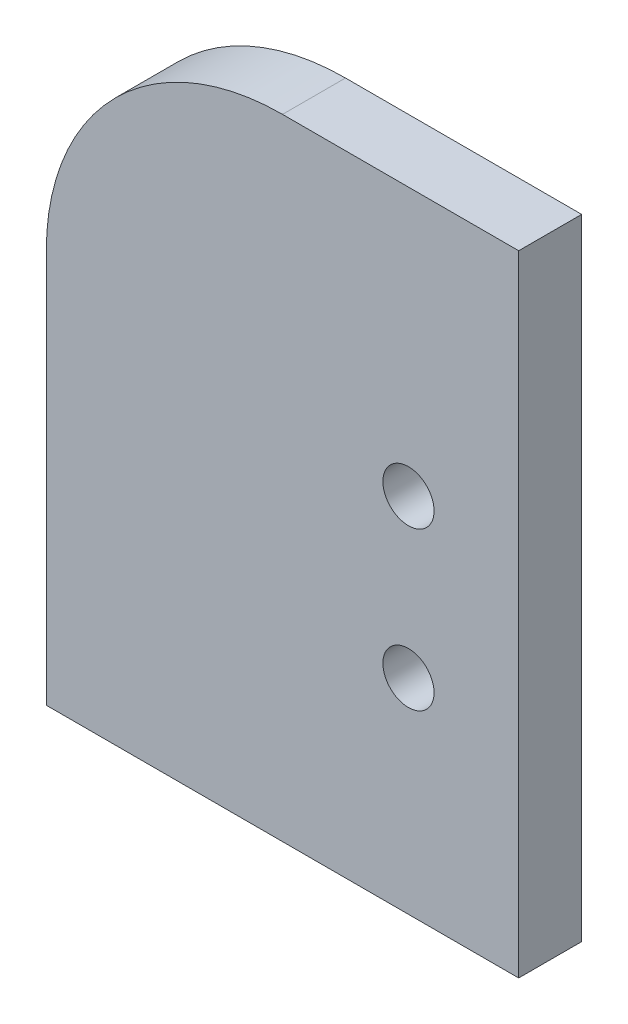
ISO-10303-21;
HEADER;
FILE_DESCRIPTION(('STEP AP214'),'2;1');
FILE_NAME('part.step','',(''),(''),'','','');
FILE_SCHEMA(('AUTOMOTIVE_DESIGN { 1 0 10303 214 1 1 1 1 }'));
ENDSEC;
DATA;
#1=APPLICATION_CONTEXT('core data for automotive mechanical design processes');
#2=APPLICATION_PROTOCOL_DEFINITION('international standard','automotive_design',2000,#1);
#3=PRODUCT_CONTEXT('',#1,'mechanical');
#4=PRODUCT('Part','Part','',(#3));
#5=PRODUCT_RELATED_PRODUCT_CATEGORY('part','',(#4));
#6=PRODUCT_DEFINITION_FORMATION('','',#4);
#7=PRODUCT_DEFINITION_CONTEXT('part definition',#1,'design');
#8=PRODUCT_DEFINITION('design','',#6,#7);
#9=PRODUCT_DEFINITION_SHAPE('','',#8);
#10=(LENGTH_UNIT() NAMED_UNIT(*) SI_UNIT(.MILLI.,.METRE.));
#11=(NAMED_UNIT(*) PLANE_ANGLE_UNIT() SI_UNIT($,.RADIAN.));
#12=(NAMED_UNIT(*) SI_UNIT($,.STERADIAN.) SOLID_ANGLE_UNIT());
#13=UNCERTAINTY_MEASURE_WITH_UNIT(LENGTH_MEASURE(1.E-05),#10,'distance_accuracy_value','');
#14=(GEOMETRIC_REPRESENTATION_CONTEXT(3) GLOBAL_UNCERTAINTY_ASSIGNED_CONTEXT((#13)) GLOBAL_UNIT_ASSIGNED_CONTEXT((#10,
#11,#12)) REPRESENTATION_CONTEXT('',''));
#15=CARTESIAN_POINT('',(0.,0.,0.));
#16=DIRECTION('',(0.,0.,1.));
#17=DIRECTION('',(1.,0.,0.));
#18=AXIS2_PLACEMENT_3D('',#15,#16,#17);
#19=CARTESIAN_POINT('',(0.,35.,4.));
#20=DIRECTION('',(-1.,0.,0.));
#21=DIRECTION('',(0.,0.,1.));
#22=AXIS2_PLACEMENT_3D('',#19,#20,#21);
#23=PLANE('',#22);
#24=DIRECTION('',(0.,1.,0.));
#25=VECTOR('',#24,1.);
#26=CARTESIAN_POINT('',(0.,35.,0.));
#27=LINE('',#26,#25);
#28=CARTESIAN_POINT('',(0.,0.,0.));
#29=VERTEX_POINT('',#28);
#30=CARTESIAN_POINT('',(0.,40.,0.));
#31=VERTEX_POINT('',#30);
#32=EDGE_CURVE('E76',#29,#31,#27,.T.);
#33=ORIENTED_EDGE('',*,*,#32,.T.);
#34=DIRECTION('',(0.,0.,-1.));
#35=VECTOR('',#34,1.);
#36=CARTESIAN_POINT('',(0.,40.,4.));
#37=LINE('',#36,#35);
#38=CARTESIAN_POINT('',(0.,40.,4.));
#39=VERTEX_POINT('',#38);
#40=EDGE_CURVE('E11',#39,#31,#37,.T.);
#41=ORIENTED_EDGE('',*,*,#40,.F.);
#42=DIRECTION('',(0.,1.,0.));
#43=VECTOR('',#42,1.);
#44=CARTESIAN_POINT('',(0.,0.,4.));
#45=LINE('',#44,#43);
#46=CARTESIAN_POINT('',(0.,0.,4.));
#47=VERTEX_POINT('',#46);
#48=EDGE_CURVE('E82',#47,#39,#45,.T.);
#49=ORIENTED_EDGE('',*,*,#48,.F.);
#50=DIRECTION('',(0.,0.,-1.));
#51=VECTOR('',#50,1.);
#52=CARTESIAN_POINT('',(0.,0.,4.));
#53=LINE('',#52,#51);
#54=EDGE_CURVE('E106',#47,#29,#53,.T.);
#55=ORIENTED_EDGE('',*,*,#54,.T.);
#56=EDGE_LOOP('',(#33,#41,#49,#55));
#57=FACE_BOUND('',#56,.T.);
#58=ADVANCED_FACE('F33',(#57),#23,.F.);
#59=CARTESIAN_POINT('',(-15.,40.,4.));
#60=DIRECTION('',(0.,-1.,0.));
#61=DIRECTION('',(0.,0.,-1.));
#62=AXIS2_PLACEMENT_3D('',#59,#60,#61);
#63=PLANE('',#62);
#64=DIRECTION('',(-1.,0.,0.));
#65=VECTOR('',#64,1.);
#66=CARTESIAN_POINT('',(-15.,40.,0.));
#67=LINE('',#66,#65);
#68=CARTESIAN_POINT('',(-15.,40.,0.));
#69=VERTEX_POINT('',#68);
#70=EDGE_CURVE('E111',#31,#69,#67,.T.);
#71=ORIENTED_EDGE('',*,*,#70,.T.);
#72=DIRECTION('',(0.,0.,-1.));
#73=VECTOR('',#72,1.);
#74=CARTESIAN_POINT('',(-15.,40.,4.));
#75=LINE('',#74,#73);
#76=CARTESIAN_POINT('',(-15.,40.,4.));
#77=VERTEX_POINT('',#76);
#78=EDGE_CURVE('E41',#77,#69,#75,.T.);
#79=ORIENTED_EDGE('',*,*,#78,.F.);
#80=DIRECTION('',(-1.,0.,0.));
#81=VECTOR('',#80,1.);
#82=CARTESIAN_POINT('',(-15.,40.,4.));
#83=LINE('',#82,#81);
#84=EDGE_CURVE('E93',#39,#77,#83,.T.);
#85=ORIENTED_EDGE('',*,*,#84,.F.);
#86=ORIENTED_EDGE('',*,*,#40,.T.);
#87=EDGE_LOOP('',(#71,#79,#85,#86));
#88=FACE_BOUND('',#87,.T.);
#89=ADVANCED_FACE('F162',(#88),#63,.F.);
#90=CARTESIAN_POINT('',(-15.,25.,4.));
#91=DIRECTION('',(0.,0.,-1.));
#92=DIRECTION('',(-1.,0.,0.));
#93=AXIS2_PLACEMENT_3D('',#90,#91,#92);
#94=CYLINDRICAL_SURFACE('',#93,15.);
#95=CARTESIAN_POINT('',(-15.,25.,0.));
#96=DIRECTION('',(0.,0.,1.));
#97=DIRECTION('',(1.,0.,0.));
#98=AXIS2_PLACEMENT_3D('',#95,#96,#97);
#99=CIRCLE('',#98,15.);
#100=CARTESIAN_POINT('',(-30.,25.,0.));
#101=VERTEX_POINT('',#100);
#102=EDGE_CURVE('E101',#69,#101,#99,.T.);
#103=ORIENTED_EDGE('',*,*,#102,.T.);
#104=DIRECTION('',(0.,0.,-1.));
#105=VECTOR('',#104,1.);
#106=CARTESIAN_POINT('',(-30.,25.,4.));
#107=LINE('',#106,#105);
#108=CARTESIAN_POINT('',(-30.,25.,4.));
#109=VERTEX_POINT('',#108);
#110=EDGE_CURVE('E98',#109,#101,#107,.T.);
#111=ORIENTED_EDGE('',*,*,#110,.F.);
#112=CARTESIAN_POINT('',(-15.,25.,4.));
#113=DIRECTION('',(0.,0.,1.));
#114=DIRECTION('',(1.,0.,0.));
#115=AXIS2_PLACEMENT_3D('',#112,#113,#114);
#116=CIRCLE('',#115,15.);
#117=EDGE_CURVE('E87',#77,#109,#116,.T.);
#118=ORIENTED_EDGE('',*,*,#117,.F.);
#119=ORIENTED_EDGE('',*,*,#78,.T.);
#120=EDGE_LOOP('',(#103,#111,#118,#119));
#121=FACE_BOUND('',#120,.T.);
#122=ADVANCED_FACE('F99',(#121),#94,.T.);
#123=CARTESIAN_POINT('',(-30.,0.,4.));
#124=DIRECTION('',(1.,0.,0.));
#125=DIRECTION('',(0.,0.,-1.));
#126=AXIS2_PLACEMENT_3D('',#123,#124,#125);
#127=PLANE('',#126);
#128=DIRECTION('',(0.,-1.,0.));
#129=VECTOR('',#128,1.);
#130=CARTESIAN_POINT('',(-30.,0.,0.));
#131=LINE('',#130,#129);
#132=CARTESIAN_POINT('',(-30.,0.,0.));
#133=VERTEX_POINT('',#132);
#134=EDGE_CURVE('E69',#101,#133,#131,.T.);
#135=ORIENTED_EDGE('',*,*,#134,.T.);
#136=DIRECTION('',(0.,0.,-1.));
#137=VECTOR('',#136,1.);
#138=CARTESIAN_POINT('',(-30.,0.,4.));
#139=LINE('',#138,#137);
#140=CARTESIAN_POINT('',(-30.,0.,4.));
#141=VERTEX_POINT('',#140);
#142=EDGE_CURVE('E102',#141,#133,#139,.T.);
#143=ORIENTED_EDGE('',*,*,#142,.F.);
#144=DIRECTION('',(0.,-1.,0.));
#145=VECTOR('',#144,1.);
#146=CARTESIAN_POINT('',(-30.,0.,4.));
#147=LINE('',#146,#145);
#148=EDGE_CURVE('E91',#109,#141,#147,.T.);
#149=ORIENTED_EDGE('',*,*,#148,.F.);
#150=ORIENTED_EDGE('',*,*,#110,.T.);
#151=EDGE_LOOP('',(#135,#143,#149,#150));
#152=FACE_BOUND('',#151,.T.);
#153=ADVANCED_FACE('F104',(#152),#127,.F.);
#154=CARTESIAN_POINT('',(0.,0.,4.));
#155=DIRECTION('',(0.,1.,0.));
#156=DIRECTION('',(-1.,0.,0.));
#157=AXIS2_PLACEMENT_3D('',#154,#155,#156);
#158=PLANE('',#157);
#159=DIRECTION('',(1.,0.,0.));
#160=VECTOR('',#159,1.);
#161=CARTESIAN_POINT('',(0.,0.,0.));
#162=LINE('',#161,#160);
#163=EDGE_CURVE('E116',#133,#29,#162,.T.);
#164=ORIENTED_EDGE('',*,*,#163,.T.);
#165=ORIENTED_EDGE('',*,*,#54,.F.);
#166=DIRECTION('',(1.,0.,0.));
#167=VECTOR('',#166,1.);
#168=CARTESIAN_POINT('',(0.,0.,4.));
#169=LINE('',#168,#167);
#170=EDGE_CURVE('E49',#141,#47,#169,.T.);
#171=ORIENTED_EDGE('',*,*,#170,.F.);
#172=ORIENTED_EDGE('',*,*,#142,.T.);
#173=EDGE_LOOP('',(#164,#165,#171,#172));
#174=FACE_BOUND('',#173,.T.);
#175=ADVANCED_FACE('F123',(#174),#158,.F.);
#176=CARTESIAN_POINT('',(-15.,25.,4.));
#177=DIRECTION('',(0.,0.,1.));
#178=DIRECTION('',(1.,0.,0.));
#179=AXIS2_PLACEMENT_3D('',#176,#177,#178);
#180=PLANE('',#179);
#181=CARTESIAN_POINT('',(-7.,13.,4.));
#182=DIRECTION('',(0.,0.,1.));
#183=DIRECTION('',(1.,0.,0.));
#184=AXIS2_PLACEMENT_3D('',#181,#182,#183);
#185=CIRCLE('',#184,1.625);
#186=CARTESIAN_POINT('',(-5.375,13.,4.));
#187=VERTEX_POINT('',#186);
#188=EDGE_CURVE('E133',#187,#187,#185,.T.);
#189=ORIENTED_EDGE('',*,*,#188,.F.);
#190=EDGE_LOOP('',(#189));
#191=FACE_BOUND('',#190,.T.);
#192=CARTESIAN_POINT('',(-7.,23.,4.));
#193=DIRECTION('',(0.,0.,1.));
#194=DIRECTION('',(1.,0.,0.));
#195=AXIS2_PLACEMENT_3D('',#192,#193,#194);
#196=CIRCLE('',#195,1.625);
#197=CARTESIAN_POINT('',(-5.375,23.,4.));
#198=VERTEX_POINT('',#197);
#199=EDGE_CURVE('E127',#198,#198,#196,.T.);
#200=ORIENTED_EDGE('',*,*,#199,.F.);
#201=EDGE_LOOP('',(#200));
#202=FACE_BOUND('',#201,.T.);
#203=ORIENTED_EDGE('',*,*,#48,.T.);
#204=ORIENTED_EDGE('',*,*,#84,.T.);
#205=ORIENTED_EDGE('',*,*,#117,.T.);
#206=ORIENTED_EDGE('',*,*,#148,.T.);
#207=ORIENTED_EDGE('',*,*,#170,.T.);
#208=EDGE_LOOP('',(#203,#204,#205,#206,#207));
#209=FACE_BOUND('',#208,.T.);
#210=ADVANCED_FACE('F89',(#191,#202,#209),#180,.T.);
#211=CARTESIAN_POINT('',(-15.,25.,0.));
#212=DIRECTION('',(0.,0.,1.));
#213=DIRECTION('',(1.,0.,0.));
#214=AXIS2_PLACEMENT_3D('',#211,#212,#213);
#215=PLANE('',#214);
#216=CARTESIAN_POINT('',(-7.,13.,0.));
#217=DIRECTION('',(0.,0.,1.));
#218=DIRECTION('',(1.,0.,0.));
#219=AXIS2_PLACEMENT_3D('',#216,#217,#218);
#220=CIRCLE('',#219,1.625);
#221=CARTESIAN_POINT('',(-5.375,13.,0.));
#222=VERTEX_POINT('',#221);
#223=EDGE_CURVE('E130',#222,#222,#220,.T.);
#224=ORIENTED_EDGE('',*,*,#223,.T.);
#225=EDGE_LOOP('',(#224));
#226=FACE_BOUND('',#225,.T.);
#227=CARTESIAN_POINT('',(-7.,23.,0.));
#228=DIRECTION('',(0.,0.,1.));
#229=DIRECTION('',(1.,0.,0.));
#230=AXIS2_PLACEMENT_3D('',#227,#228,#229);
#231=CIRCLE('',#230,1.625);
#232=CARTESIAN_POINT('',(-5.375,23.,0.));
#233=VERTEX_POINT('',#232);
#234=EDGE_CURVE('E112',#233,#233,#231,.T.);
#235=ORIENTED_EDGE('',*,*,#234,.T.);
#236=EDGE_LOOP('',(#235));
#237=FACE_BOUND('',#236,.T.);
#238=ORIENTED_EDGE('',*,*,#32,.F.);
#239=ORIENTED_EDGE('',*,*,#163,.F.);
#240=ORIENTED_EDGE('',*,*,#134,.F.);
#241=ORIENTED_EDGE('',*,*,#102,.F.);
#242=ORIENTED_EDGE('',*,*,#70,.F.);
#243=EDGE_LOOP('',(#238,#239,#240,#241,#242));
#244=FACE_BOUND('',#243,.T.);
#245=ADVANCED_FACE('F121',(#226,#237,#244),#215,.F.);
#246=CARTESIAN_POINT('',(-7.,23.,0.));
#247=DIRECTION('',(0.,0.,1.));
#248=DIRECTION('',(1.,0.,0.));
#249=AXIS2_PLACEMENT_3D('',#246,#247,#248);
#250=CYLINDRICAL_SURFACE('',#249,1.625);
#251=ORIENTED_EDGE('',*,*,#234,.F.);
#252=EDGE_LOOP('',(#251));
#253=FACE_BOUND('',#252,.T.);
#254=ORIENTED_EDGE('',*,*,#199,.T.);
#255=EDGE_LOOP('',(#254));
#256=FACE_BOUND('',#255,.T.);
#257=ADVANCED_FACE('F144',(#253,#256),#250,.F.);
#258=CARTESIAN_POINT('',(-7.,13.,0.));
#259=DIRECTION('',(0.,0.,1.));
#260=DIRECTION('',(1.,0.,0.));
#261=AXIS2_PLACEMENT_3D('',#258,#259,#260);
#262=CYLINDRICAL_SURFACE('',#261,1.625);
#263=ORIENTED_EDGE('',*,*,#223,.F.);
#264=EDGE_LOOP('',(#263));
#265=FACE_BOUND('',#264,.T.);
#266=ORIENTED_EDGE('',*,*,#188,.T.);
#267=EDGE_LOOP('',(#266));
#268=FACE_BOUND('',#267,.T.);
#269=ADVANCED_FACE('F141',(#265,#268),#262,.F.);
#270=CLOSED_SHELL('',(#58,#89,#122,#153,#175,#210,#245,#257,#269));
#271=MANIFOLD_SOLID_BREP('B2',#270);
#272=ADVANCED_BREP_SHAPE_REPRESENTATION('',(#18,#271),#14);
#273=SHAPE_DEFINITION_REPRESENTATION(#9,#272);
ENDSEC;
END-ISO-10303-21;
